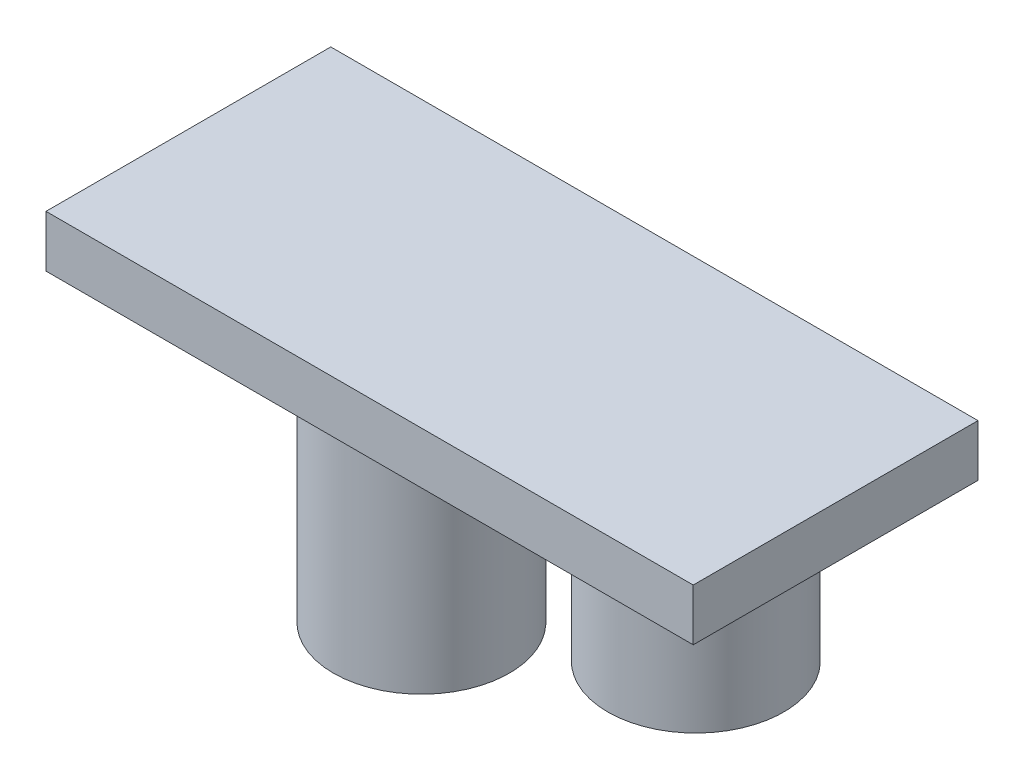
ISO-10303-21;
HEADER;
FILE_DESCRIPTION(('STEP AP214'),'2;1');
FILE_NAME('part.step','',(''),(''),'','','');
FILE_SCHEMA(('AUTOMOTIVE_DESIGN { 1 0 10303 214 1 1 1 1 }'));
ENDSEC;
DATA;
#1=APPLICATION_CONTEXT('core data for automotive mechanical design processes');
#2=APPLICATION_PROTOCOL_DEFINITION('international standard','automotive_design',2000,#1);
#3=PRODUCT_CONTEXT('',#1,'mechanical');
#4=PRODUCT('Part','Part','',(#3));
#5=PRODUCT_RELATED_PRODUCT_CATEGORY('part','',(#4));
#6=PRODUCT_DEFINITION_FORMATION('','',#4);
#7=PRODUCT_DEFINITION_CONTEXT('part definition',#1,'design');
#8=PRODUCT_DEFINITION('design','',#6,#7);
#9=PRODUCT_DEFINITION_SHAPE('','',#8);
#10=(LENGTH_UNIT() NAMED_UNIT(*) SI_UNIT(.MILLI.,.METRE.));
#11=(NAMED_UNIT(*) PLANE_ANGLE_UNIT() SI_UNIT($,.RADIAN.));
#12=(NAMED_UNIT(*) SI_UNIT($,.STERADIAN.) SOLID_ANGLE_UNIT());
#13=UNCERTAINTY_MEASURE_WITH_UNIT(LENGTH_MEASURE(1.E-05),#10,'distance_accuracy_value','');
#14=(GEOMETRIC_REPRESENTATION_CONTEXT(3) GLOBAL_UNCERTAINTY_ASSIGNED_CONTEXT((#13)) GLOBAL_UNIT_ASSIGNED_CONTEXT((#10,
#11,#12)) REPRESENTATION_CONTEXT('',''));
#15=CARTESIAN_POINT('',(0.,0.,0.));
#16=DIRECTION('',(0.,0.,1.));
#17=DIRECTION('',(1.,0.,0.));
#18=AXIS2_PLACEMENT_3D('',#15,#16,#17);
#19=CARTESIAN_POINT('',(0.,-5.,0.));
#20=DIRECTION('',(0.,1.,0.));
#21=DIRECTION('',(0.,0.,1.));
#22=AXIS2_PLACEMENT_3D('',#19,#20,#21);
#23=CYLINDRICAL_SURFACE('',#22,1.7);
#24=CARTESIAN_POINT('',(0.,-5.,0.));
#25=DIRECTION('',(0.,1.,0.));
#26=DIRECTION('',(0.,0.,1.));
#27=AXIS2_PLACEMENT_3D('',#24,#25,#26);
#28=CIRCLE('',#27,1.7);
#29=CARTESIAN_POINT('',(0.,-5.,1.7));
#30=VERTEX_POINT('',#29);
#31=EDGE_CURVE('E11',#30,#30,#28,.T.);
#32=ORIENTED_EDGE('',*,*,#31,.T.);
#33=EDGE_LOOP('',(#32));
#34=FACE_BOUND('',#33,.T.);
#35=CARTESIAN_POINT('',(0.,0.,0.));
#36=DIRECTION('',(0.,1.,0.));
#37=DIRECTION('',(0.,0.,1.));
#38=AXIS2_PLACEMENT_3D('',#35,#36,#37);
#39=CIRCLE('',#38,1.7);
#40=CARTESIAN_POINT('',(0.,0.,1.7));
#41=VERTEX_POINT('',#40);
#42=EDGE_CURVE('E38',#41,#41,#39,.T.);
#43=ORIENTED_EDGE('',*,*,#42,.F.);
#44=EDGE_LOOP('',(#43));
#45=FACE_BOUND('',#44,.T.);
#46=ADVANCED_FACE('F35',(#34,#45),#23,.T.);
#47=CARTESIAN_POINT('',(0.,-5.,0.));
#48=DIRECTION('',(0.,1.,0.));
#49=DIRECTION('',(0.,0.,1.));
#50=AXIS2_PLACEMENT_3D('',#47,#48,#49);
#51=PLANE('',#50);
#52=ORIENTED_EDGE('',*,*,#31,.F.);
#53=EDGE_LOOP('',(#52));
#54=FACE_BOUND('',#53,.T.);
#55=ADVANCED_FACE('F118',(#54),#51,.F.);
#56=CARTESIAN_POINT('',(-4.5,1.,2.75));
#57=DIRECTION('',(1.,0.,0.));
#58=DIRECTION('',(0.,0.,-1.));
#59=AXIS2_PLACEMENT_3D('',#56,#57,#58);
#60=PLANE('',#59);
#61=DIRECTION('',(0.,0.,1.));
#62=VECTOR('',#61,1.);
#63=CARTESIAN_POINT('',(-4.5,0.,2.75));
#64=LINE('',#63,#62);
#65=CARTESIAN_POINT('',(-4.5,0.,-2.75));
#66=VERTEX_POINT('',#65);
#67=CARTESIAN_POINT('',(-4.5,0.,2.75));
#68=VERTEX_POINT('',#67);
#69=EDGE_CURVE('E102',#66,#68,#64,.T.);
#70=ORIENTED_EDGE('',*,*,#69,.T.);
#71=DIRECTION('',(0.,-1.,0.));
#72=VECTOR('',#71,1.);
#73=CARTESIAN_POINT('',(-4.5,1.,2.75));
#74=LINE('',#73,#72);
#75=CARTESIAN_POINT('',(-4.5,1.,2.75));
#76=VERTEX_POINT('',#75);
#77=EDGE_CURVE('E93',#76,#68,#74,.T.);
#78=ORIENTED_EDGE('',*,*,#77,.F.);
#79=DIRECTION('',(0.,0.,1.));
#80=VECTOR('',#79,1.);
#81=CARTESIAN_POINT('',(-4.5,1.,2.75));
#82=LINE('',#81,#80);
#83=CARTESIAN_POINT('',(-4.5,1.,-2.75));
#84=VERTEX_POINT('',#83);
#85=EDGE_CURVE('E87',#84,#76,#82,.T.);
#86=ORIENTED_EDGE('',*,*,#85,.F.);
#87=DIRECTION('',(0.,-1.,0.));
#88=VECTOR('',#87,1.);
#89=CARTESIAN_POINT('',(-4.5,1.,-2.75));
#90=LINE('',#89,#88);
#91=EDGE_CURVE('E98',#84,#66,#90,.T.);
#92=ORIENTED_EDGE('',*,*,#91,.T.);
#93=EDGE_LOOP('',(#70,#78,#86,#92));
#94=FACE_BOUND('',#93,.T.);
#95=ADVANCED_FACE('F123',(#94),#60,.F.);
#96=CARTESIAN_POINT('',(-4.5,1.,2.75));
#97=DIRECTION('',(0.,0.,-1.));
#98=DIRECTION('',(-1.,0.,0.));
#99=AXIS2_PLACEMENT_3D('',#96,#97,#98);
#100=PLANE('',#99);
#101=DIRECTION('',(1.,0.,0.));
#102=VECTOR('',#101,1.);
#103=CARTESIAN_POINT('',(-4.5,0.,2.75));
#104=LINE('',#103,#102);
#105=CARTESIAN_POINT('',(8.,0.,2.75));
#106=VERTEX_POINT('',#105);
#107=EDGE_CURVE('E92',#68,#106,#104,.T.);
#108=ORIENTED_EDGE('',*,*,#107,.T.);
#109=DIRECTION('',(0.,-1.,0.));
#110=VECTOR('',#109,1.);
#111=CARTESIAN_POINT('',(8.,1.,2.75));
#112=LINE('',#111,#110);
#113=CARTESIAN_POINT('',(8.,1.,2.75));
#114=VERTEX_POINT('',#113);
#115=EDGE_CURVE('E90',#114,#106,#112,.T.);
#116=ORIENTED_EDGE('',*,*,#115,.F.);
#117=DIRECTION('',(1.,0.,0.));
#118=VECTOR('',#117,1.);
#119=CARTESIAN_POINT('',(-4.5,1.,2.75));
#120=LINE('',#119,#118);
#121=EDGE_CURVE('E82',#76,#114,#120,.T.);
#122=ORIENTED_EDGE('',*,*,#121,.F.);
#123=ORIENTED_EDGE('',*,*,#77,.T.);
#124=EDGE_LOOP('',(#108,#116,#122,#123));
#125=FACE_BOUND('',#124,.T.);
#126=ADVANCED_FACE('F91',(#125),#100,.F.);
#127=CARTESIAN_POINT('',(8.,1.,2.75));
#128=DIRECTION('',(-1.,0.,0.));
#129=DIRECTION('',(0.,0.,1.));
#130=AXIS2_PLACEMENT_3D('',#127,#128,#129);
#131=PLANE('',#130);
#132=DIRECTION('',(0.,0.,-1.));
#133=VECTOR('',#132,1.);
#134=CARTESIAN_POINT('',(8.,0.,2.75));
#135=LINE('',#134,#133);
#136=CARTESIAN_POINT('',(8.,0.,-2.75));
#137=VERTEX_POINT('',#136);
#138=EDGE_CURVE('E68',#106,#137,#135,.T.);
#139=ORIENTED_EDGE('',*,*,#138,.T.);
#140=DIRECTION('',(0.,-1.,0.));
#141=VECTOR('',#140,1.);
#142=CARTESIAN_POINT('',(8.,1.,-2.75));
#143=LINE('',#142,#141);
#144=CARTESIAN_POINT('',(8.,1.,-2.75));
#145=VERTEX_POINT('',#144);
#146=EDGE_CURVE('E94',#145,#137,#143,.T.);
#147=ORIENTED_EDGE('',*,*,#146,.F.);
#148=DIRECTION('',(0.,0.,-1.));
#149=VECTOR('',#148,1.);
#150=CARTESIAN_POINT('',(8.,1.,2.75));
#151=LINE('',#150,#149);
#152=EDGE_CURVE('E85',#114,#145,#151,.T.);
#153=ORIENTED_EDGE('',*,*,#152,.F.);
#154=ORIENTED_EDGE('',*,*,#115,.T.);
#155=EDGE_LOOP('',(#139,#147,#153,#154));
#156=FACE_BOUND('',#155,.T.);
#157=ADVANCED_FACE('F96',(#156),#131,.F.);
#158=CARTESIAN_POINT('',(-4.5,1.,-2.75));
#159=DIRECTION('',(0.,0.,1.));
#160=DIRECTION('',(1.,0.,0.));
#161=AXIS2_PLACEMENT_3D('',#158,#159,#160);
#162=PLANE('',#161);
#163=DIRECTION('',(-1.,0.,0.));
#164=VECTOR('',#163,1.);
#165=CARTESIAN_POINT('',(-4.5,0.,-2.75));
#166=LINE('',#165,#164);
#167=EDGE_CURVE('E74',#137,#66,#166,.T.);
#168=ORIENTED_EDGE('',*,*,#167,.T.);
#169=ORIENTED_EDGE('',*,*,#91,.F.);
#170=DIRECTION('',(-1.,0.,0.));
#171=VECTOR('',#170,1.);
#172=CARTESIAN_POINT('',(-4.5,1.,-2.75));
#173=LINE('',#172,#171);
#174=EDGE_CURVE('E51',#145,#84,#173,.T.);
#175=ORIENTED_EDGE('',*,*,#174,.F.);
#176=ORIENTED_EDGE('',*,*,#146,.T.);
#177=EDGE_LOOP('',(#168,#169,#175,#176));
#178=FACE_BOUND('',#177,.T.);
#179=ADVANCED_FACE('F136',(#178),#162,.F.);
#180=CARTESIAN_POINT('',(0.,1.,0.));
#181=DIRECTION('',(0.,-1.,0.));
#182=DIRECTION('',(0.,0.,-1.));
#183=AXIS2_PLACEMENT_3D('',#180,#181,#182);
#184=PLANE('',#183);
#185=ORIENTED_EDGE('',*,*,#85,.T.);
#186=ORIENTED_EDGE('',*,*,#121,.T.);
#187=ORIENTED_EDGE('',*,*,#152,.T.);
#188=ORIENTED_EDGE('',*,*,#174,.T.);
#189=EDGE_LOOP('',(#185,#186,#187,#188));
#190=FACE_BOUND('',#189,.T.);
#191=ADVANCED_FACE('F83',(#190),#184,.F.);
#192=CARTESIAN_POINT('',(0.,0.,0.));
#193=DIRECTION('',(0.,-1.,0.));
#194=DIRECTION('',(0.,0.,-1.));
#195=AXIS2_PLACEMENT_3D('',#192,#193,#194);
#196=PLANE('',#195);
#197=CARTESIAN_POINT('',(5.3,0.,0.));
#198=DIRECTION('',(0.,-1.,0.));
#199=DIRECTION('',(0.,0.,-1.));
#200=AXIS2_PLACEMENT_3D('',#197,#198,#199);
#201=CIRCLE('',#200,1.7);
#202=CARTESIAN_POINT('',(5.3,0.,-1.7));
#203=VERTEX_POINT('',#202);
#204=EDGE_CURVE('E155',#203,#203,#201,.T.);
#205=ORIENTED_EDGE('',*,*,#204,.F.);
#206=EDGE_LOOP('',(#205));
#207=FACE_BOUND('',#206,.T.);
#208=ORIENTED_EDGE('',*,*,#42,.T.);
#209=EDGE_LOOP('',(#208));
#210=FACE_BOUND('',#209,.T.);
#211=ORIENTED_EDGE('',*,*,#69,.F.);
#212=ORIENTED_EDGE('',*,*,#167,.F.);
#213=ORIENTED_EDGE('',*,*,#138,.F.);
#214=ORIENTED_EDGE('',*,*,#107,.F.);
#215=EDGE_LOOP('',(#211,#212,#213,#214));
#216=FACE_BOUND('',#215,.T.);
#217=ADVANCED_FACE('F114',(#207,#210,#216),#196,.T.);
#218=CARTESIAN_POINT('',(5.3,-3.,0.));
#219=DIRECTION('',(0.,1.,0.));
#220=DIRECTION('',(0.,0.,1.));
#221=AXIS2_PLACEMENT_3D('',#218,#219,#220);
#222=CYLINDRICAL_SURFACE('',#221,1.7);
#223=CARTESIAN_POINT('',(5.3,-3.,0.));
#224=DIRECTION('',(0.,-1.,0.));
#225=DIRECTION('',(0.,0.,-1.));
#226=AXIS2_PLACEMENT_3D('',#223,#224,#225);
#227=CIRCLE('',#226,1.7);
#228=CARTESIAN_POINT('',(5.3,-3.,-1.7));
#229=VERTEX_POINT('',#228);
#230=EDGE_CURVE('E105',#229,#229,#227,.T.);
#231=ORIENTED_EDGE('',*,*,#230,.F.);
#232=EDGE_LOOP('',(#231));
#233=FACE_BOUND('',#232,.T.);
#234=ORIENTED_EDGE('',*,*,#204,.T.);
#235=EDGE_LOOP('',(#234));
#236=FACE_BOUND('',#235,.T.);
#237=ADVANCED_FACE('F141',(#233,#236),#222,.T.);
#238=CARTESIAN_POINT('',(5.3,-3.,0.));
#239=DIRECTION('',(0.,-1.,0.));
#240=DIRECTION('',(0.,0.,-1.));
#241=AXIS2_PLACEMENT_3D('',#238,#239,#240);
#242=PLANE('',#241);
#243=ORIENTED_EDGE('',*,*,#230,.T.);
#244=EDGE_LOOP('',(#243));
#245=FACE_BOUND('',#244,.T.);
#246=ADVANCED_FACE('F147',(#245),#242,.T.);
#247=CLOSED_SHELL('',(#46,#55,#95,#126,#157,#179,#191,#217,#237,#246));
#248=MANIFOLD_SOLID_BREP('B2',#247);
#249=ADVANCED_BREP_SHAPE_REPRESENTATION('',(#18,#248),#14);
#250=SHAPE_DEFINITION_REPRESENTATION(#9,#249);
ENDSEC;
END-ISO-10303-21;
